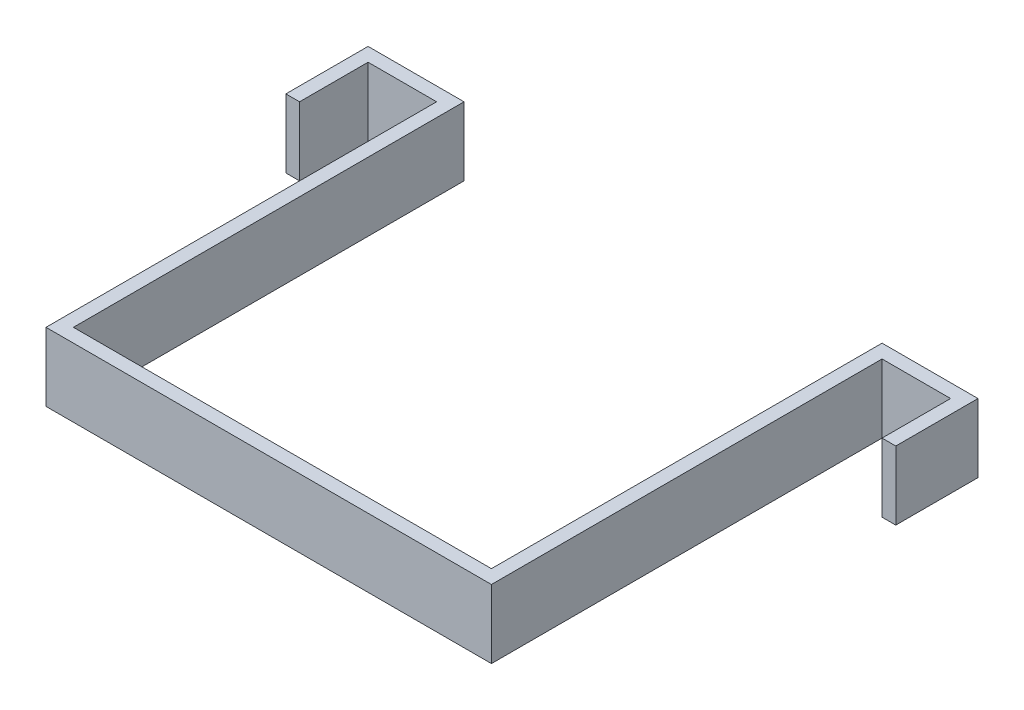
ISO-10303-21;
HEADER;
FILE_DESCRIPTION(('STEP AP214'),'2;1');
FILE_NAME('part.step','',(''),(''),'','','');
FILE_SCHEMA(('AUTOMOTIVE_DESIGN { 1 0 10303 214 1 1 1 1 }'));
ENDSEC;
DATA;
#1=APPLICATION_CONTEXT('core data for automotive mechanical design processes');
#2=APPLICATION_PROTOCOL_DEFINITION('international standard','automotive_design',2000,#1);
#3=PRODUCT_CONTEXT('',#1,'mechanical');
#4=PRODUCT('Part','Part','',(#3));
#5=PRODUCT_RELATED_PRODUCT_CATEGORY('part','',(#4));
#6=PRODUCT_DEFINITION_FORMATION('','',#4);
#7=PRODUCT_DEFINITION_CONTEXT('part definition',#1,'design');
#8=PRODUCT_DEFINITION('design','',#6,#7);
#9=PRODUCT_DEFINITION_SHAPE('','',#8);
#10=(LENGTH_UNIT() NAMED_UNIT(*) SI_UNIT(.MILLI.,.METRE.));
#11=(NAMED_UNIT(*) PLANE_ANGLE_UNIT() SI_UNIT($,.RADIAN.));
#12=(NAMED_UNIT(*) SI_UNIT($,.STERADIAN.) SOLID_ANGLE_UNIT());
#13=UNCERTAINTY_MEASURE_WITH_UNIT(LENGTH_MEASURE(1.E-05),#10,'distance_accuracy_value','');
#14=(GEOMETRIC_REPRESENTATION_CONTEXT(3) GLOBAL_UNCERTAINTY_ASSIGNED_CONTEXT((#13)) GLOBAL_UNIT_ASSIGNED_CONTEXT((#10,
#11,#12)) REPRESENTATION_CONTEXT('',''));
#15=CARTESIAN_POINT('',(0.,0.,0.));
#16=DIRECTION('',(0.,0.,1.));
#17=DIRECTION('',(1.,0.,0.));
#18=AXIS2_PLACEMENT_3D('',#15,#16,#17);
#19=CARTESIAN_POINT('',(-113.03,12.7,25.4));
#20=DIRECTION('',(0.,0.,-1.));
#21=DIRECTION('',(-1.,0.,0.));
#22=AXIS2_PLACEMENT_3D('',#19,#20,#21);
#23=PLANE('',#22);
#24=DIRECTION('',(1.,0.,0.));
#25=VECTOR('',#24,1.);
#26=CARTESIAN_POINT('',(-113.03,-12.7,25.4));
#27=LINE('',#26,#25);
#28=CARTESIAN_POINT('',(-113.03,-12.7,25.4));
#29=VERTEX_POINT('',#28);
#30=CARTESIAN_POINT('',(-107.95,-12.7,25.4));
#31=VERTEX_POINT('',#30);
#32=EDGE_CURVE('E177',#29,#31,#27,.T.);
#33=ORIENTED_EDGE('',*,*,#32,.T.);
#34=DIRECTION('',(0.,-1.,0.));
#35=VECTOR('',#34,1.);
#36=CARTESIAN_POINT('',(-107.95,12.7,25.4));
#37=LINE('',#36,#35);
#38=CARTESIAN_POINT('',(-107.95,12.7,25.4));
#39=VERTEX_POINT('',#38);
#40=EDGE_CURVE('E11',#39,#31,#37,.T.);
#41=ORIENTED_EDGE('',*,*,#40,.F.);
#42=DIRECTION('',(1.,0.,0.));
#43=VECTOR('',#42,1.);
#44=CARTESIAN_POINT('',(-113.03,12.7,25.4));
#45=LINE('',#44,#43);
#46=CARTESIAN_POINT('',(-113.03,12.7,25.4));
#47=VERTEX_POINT('',#46);
#48=EDGE_CURVE('E207',#47,#39,#45,.T.);
#49=ORIENTED_EDGE('',*,*,#48,.F.);
#50=DIRECTION('',(0.,-1.,0.));
#51=VECTOR('',#50,1.);
#52=CARTESIAN_POINT('',(-113.03,12.7,25.4));
#53=LINE('',#52,#51);
#54=EDGE_CURVE('E173',#47,#29,#53,.T.);
#55=ORIENTED_EDGE('',*,*,#54,.T.);
#56=EDGE_LOOP('',(#33,#41,#49,#55));
#57=FACE_BOUND('',#56,.T.);
#58=ADVANCED_FACE('F33',(#57),#23,.F.);
#59=CARTESIAN_POINT('',(-107.95,12.7,25.4));
#60=DIRECTION('',(-1.,0.,0.));
#61=DIRECTION('',(0.,0.,1.));
#62=AXIS2_PLACEMENT_3D('',#59,#60,#61);
#63=PLANE('',#62);
#64=DIRECTION('',(0.,0.,-1.));
#65=VECTOR('',#64,1.);
#66=CARTESIAN_POINT('',(-107.95,-12.7,25.4));
#67=LINE('',#66,#65);
#68=CARTESIAN_POINT('',(-107.95,-12.7,0.));
#69=VERTEX_POINT('',#68);
#70=EDGE_CURVE('E180',#31,#69,#67,.T.);
#71=ORIENTED_EDGE('',*,*,#70,.T.);
#72=DIRECTION('',(0.,-1.,0.));
#73=VECTOR('',#72,1.);
#74=CARTESIAN_POINT('',(-107.95,12.7,0.));
#75=LINE('',#74,#73);
#76=CARTESIAN_POINT('',(-107.95,12.7,0.));
#77=VERTEX_POINT('',#76);
#78=EDGE_CURVE('E41',#77,#69,#75,.T.);
#79=ORIENTED_EDGE('',*,*,#78,.F.);
#80=DIRECTION('',(0.,0.,-1.));
#81=VECTOR('',#80,1.);
#82=CARTESIAN_POINT('',(-107.95,12.7,25.4));
#83=LINE('',#82,#81);
#84=EDGE_CURVE('E116',#39,#77,#83,.T.);
#85=ORIENTED_EDGE('',*,*,#84,.F.);
#86=ORIENTED_EDGE('',*,*,#40,.T.);
#87=EDGE_LOOP('',(#71,#79,#85,#86));
#88=FACE_BOUND('',#87,.T.);
#89=ADVANCED_FACE('F305',(#88),#63,.F.);
#90=CARTESIAN_POINT('',(-107.95,12.7,0.));
#91=DIRECTION('',(0.,0.,-1.));
#92=DIRECTION('',(-1.,0.,0.));
#93=AXIS2_PLACEMENT_3D('',#90,#91,#92);
#94=PLANE('',#93);
#95=DIRECTION('',(1.,0.,0.));
#96=VECTOR('',#95,1.);
#97=CARTESIAN_POINT('',(-107.95,-12.7,0.));
#98=LINE('',#97,#96);
#99=CARTESIAN_POINT('',(-82.55,-12.7,0.));
#100=VERTEX_POINT('',#99);
#101=EDGE_CURVE('E182',#69,#100,#98,.T.);
#102=ORIENTED_EDGE('',*,*,#101,.T.);
#103=DIRECTION('',(0.,-1.,0.));
#104=VECTOR('',#103,1.);
#105=CARTESIAN_POINT('',(-82.55,12.7,0.));
#106=LINE('',#105,#104);
#107=CARTESIAN_POINT('',(-82.55,12.7,0.));
#108=VERTEX_POINT('',#107);
#109=EDGE_CURVE('E238',#108,#100,#106,.T.);
#110=ORIENTED_EDGE('',*,*,#109,.F.);
#111=DIRECTION('',(1.,0.,0.));
#112=VECTOR('',#111,1.);
#113=CARTESIAN_POINT('',(-107.95,12.7,0.));
#114=LINE('',#113,#112);
#115=EDGE_CURVE('E246',#77,#108,#114,.T.);
#116=ORIENTED_EDGE('',*,*,#115,.F.);
#117=ORIENTED_EDGE('',*,*,#78,.T.);
#118=EDGE_LOOP('',(#102,#110,#116,#117));
#119=FACE_BOUND('',#118,.T.);
#120=ADVANCED_FACE('F244',(#119),#94,.F.);
#121=CARTESIAN_POINT('',(-82.55,12.7,144.78));
#122=DIRECTION('',(1.,0.,0.));
#123=DIRECTION('',(0.,0.,-1.));
#124=AXIS2_PLACEMENT_3D('',#121,#122,#123);
#125=PLANE('',#124);
#126=DIRECTION('',(0.,0.,1.));
#127=VECTOR('',#126,1.);
#128=CARTESIAN_POINT('',(-82.55,-12.7,144.78));
#129=LINE('',#128,#127);
#130=CARTESIAN_POINT('',(-82.55,-12.7,144.78));
#131=VERTEX_POINT('',#130);
#132=EDGE_CURVE('E184',#100,#131,#129,.T.);
#133=ORIENTED_EDGE('',*,*,#132,.T.);
#134=DIRECTION('',(0.,-1.,0.));
#135=VECTOR('',#134,1.);
#136=CARTESIAN_POINT('',(-82.55,12.7,144.78));
#137=LINE('',#136,#135);
#138=CARTESIAN_POINT('',(-82.55,12.7,144.78));
#139=VERTEX_POINT('',#138);
#140=EDGE_CURVE('E235',#139,#131,#137,.T.);
#141=ORIENTED_EDGE('',*,*,#140,.F.);
#142=DIRECTION('',(0.,0.,1.));
#143=VECTOR('',#142,1.);
#144=CARTESIAN_POINT('',(-82.55,12.7,144.78));
#145=LINE('',#144,#143);
#146=EDGE_CURVE('E264',#108,#139,#145,.T.);
#147=ORIENTED_EDGE('',*,*,#146,.F.);
#148=ORIENTED_EDGE('',*,*,#109,.T.);
#149=EDGE_LOOP('',(#133,#141,#147,#148));
#150=FACE_BOUND('',#149,.T.);
#151=ADVANCED_FACE('F255',(#150),#125,.F.);
#152=CARTESIAN_POINT('',(82.55,12.7,144.78));
#153=DIRECTION('',(0.,0.,-1.));
#154=DIRECTION('',(-1.,0.,0.));
#155=AXIS2_PLACEMENT_3D('',#152,#153,#154);
#156=PLANE('',#155);
#157=DIRECTION('',(1.,0.,0.));
#158=VECTOR('',#157,1.);
#159=CARTESIAN_POINT('',(82.55,-12.7,144.78));
#160=LINE('',#159,#158);
#161=CARTESIAN_POINT('',(82.55,-12.7,144.78));
#162=VERTEX_POINT('',#161);
#163=EDGE_CURVE('E186',#131,#162,#160,.T.);
#164=ORIENTED_EDGE('',*,*,#163,.T.);
#165=DIRECTION('',(0.,-1.,0.));
#166=VECTOR('',#165,1.);
#167=CARTESIAN_POINT('',(82.55,12.7,144.78));
#168=LINE('',#167,#166);
#169=CARTESIAN_POINT('',(82.55,12.7,144.78));
#170=VERTEX_POINT('',#169);
#171=EDGE_CURVE('E232',#170,#162,#168,.T.);
#172=ORIENTED_EDGE('',*,*,#171,.F.);
#173=DIRECTION('',(1.,0.,0.));
#174=VECTOR('',#173,1.);
#175=CARTESIAN_POINT('',(82.55,12.7,144.78));
#176=LINE('',#175,#174);
#177=EDGE_CURVE('E261',#139,#170,#176,.T.);
#178=ORIENTED_EDGE('',*,*,#177,.F.);
#179=ORIENTED_EDGE('',*,*,#140,.T.);
#180=EDGE_LOOP('',(#164,#172,#178,#179));
#181=FACE_BOUND('',#180,.T.);
#182=ADVANCED_FACE('F259',(#181),#156,.F.);
#183=CARTESIAN_POINT('',(82.55,12.7,144.78));
#184=DIRECTION('',(-1.,0.,0.));
#185=DIRECTION('',(0.,0.,1.));
#186=AXIS2_PLACEMENT_3D('',#183,#184,#185);
#187=PLANE('',#186);
#188=DIRECTION('',(0.,0.,-1.));
#189=VECTOR('',#188,1.);
#190=CARTESIAN_POINT('',(82.55,-12.7,144.78));
#191=LINE('',#190,#189);
#192=CARTESIAN_POINT('',(82.55,-12.7,0.));
#193=VERTEX_POINT('',#192);
#194=EDGE_CURVE('E188',#162,#193,#191,.T.);
#195=ORIENTED_EDGE('',*,*,#194,.T.);
#196=DIRECTION('',(0.,-1.,0.));
#197=VECTOR('',#196,1.);
#198=CARTESIAN_POINT('',(82.55,12.7,0.));
#199=LINE('',#198,#197);
#200=CARTESIAN_POINT('',(82.55,12.7,0.));
#201=VERTEX_POINT('',#200);
#202=EDGE_CURVE('E229',#201,#193,#199,.T.);
#203=ORIENTED_EDGE('',*,*,#202,.F.);
#204=DIRECTION('',(0.,0.,-1.));
#205=VECTOR('',#204,1.);
#206=CARTESIAN_POINT('',(82.55,12.7,144.78));
#207=LINE('',#206,#205);
#208=EDGE_CURVE('E263',#170,#201,#207,.T.);
#209=ORIENTED_EDGE('',*,*,#208,.F.);
#210=ORIENTED_EDGE('',*,*,#171,.T.);
#211=EDGE_LOOP('',(#195,#203,#209,#210));
#212=FACE_BOUND('',#211,.T.);
#213=ADVANCED_FACE('F318',(#212),#187,.F.);
#214=CARTESIAN_POINT('',(107.95,12.7,0.));
#215=DIRECTION('',(0.,0.,-1.));
#216=DIRECTION('',(-1.,0.,0.));
#217=AXIS2_PLACEMENT_3D('',#214,#215,#216);
#218=PLANE('',#217);
#219=DIRECTION('',(1.,0.,0.));
#220=VECTOR('',#219,1.);
#221=CARTESIAN_POINT('',(107.95,-12.7,0.));
#222=LINE('',#221,#220);
#223=CARTESIAN_POINT('',(107.95,-12.7,0.));
#224=VERTEX_POINT('',#223);
#225=EDGE_CURVE('E190',#193,#224,#222,.T.);
#226=ORIENTED_EDGE('',*,*,#225,.T.);
#227=DIRECTION('',(0.,-1.,0.));
#228=VECTOR('',#227,1.);
#229=CARTESIAN_POINT('',(107.95,12.7,0.));
#230=LINE('',#229,#228);
#231=CARTESIAN_POINT('',(107.95,12.7,0.));
#232=VERTEX_POINT('',#231);
#233=EDGE_CURVE('E226',#232,#224,#230,.T.);
#234=ORIENTED_EDGE('',*,*,#233,.F.);
#235=DIRECTION('',(1.,0.,0.));
#236=VECTOR('',#235,1.);
#237=CARTESIAN_POINT('',(107.95,12.7,0.));
#238=LINE('',#237,#236);
#239=EDGE_CURVE('E266',#201,#232,#238,.T.);
#240=ORIENTED_EDGE('',*,*,#239,.F.);
#241=ORIENTED_EDGE('',*,*,#202,.T.);
#242=EDGE_LOOP('',(#226,#234,#240,#241));
#243=FACE_BOUND('',#242,.T.);
#244=ADVANCED_FACE('F321',(#243),#218,.F.);
#245=CARTESIAN_POINT('',(107.95,12.7,25.4));
#246=DIRECTION('',(1.,0.,0.));
#247=DIRECTION('',(0.,0.,-1.));
#248=AXIS2_PLACEMENT_3D('',#245,#246,#247);
#249=PLANE('',#248);
#250=DIRECTION('',(0.,0.,1.));
#251=VECTOR('',#250,1.);
#252=CARTESIAN_POINT('',(107.95,-12.7,25.4));
#253=LINE('',#252,#251);
#254=CARTESIAN_POINT('',(107.95,-12.7,25.4));
#255=VERTEX_POINT('',#254);
#256=EDGE_CURVE('E192',#224,#255,#253,.T.);
#257=ORIENTED_EDGE('',*,*,#256,.T.);
#258=DIRECTION('',(0.,-1.,0.));
#259=VECTOR('',#258,1.);
#260=CARTESIAN_POINT('',(107.95,12.7,25.4));
#261=LINE('',#260,#259);
#262=CARTESIAN_POINT('',(107.95,12.7,25.4));
#263=VERTEX_POINT('',#262);
#264=EDGE_CURVE('E223',#263,#255,#261,.T.);
#265=ORIENTED_EDGE('',*,*,#264,.F.);
#266=DIRECTION('',(0.,0.,1.));
#267=VECTOR('',#266,1.);
#268=CARTESIAN_POINT('',(107.95,12.7,25.4));
#269=LINE('',#268,#267);
#270=EDGE_CURVE('E272',#232,#263,#269,.T.);
#271=ORIENTED_EDGE('',*,*,#270,.F.);
#272=ORIENTED_EDGE('',*,*,#233,.T.);
#273=EDGE_LOOP('',(#257,#265,#271,#272));
#274=FACE_BOUND('',#273,.T.);
#275=ADVANCED_FACE('F325',(#274),#249,.F.);
#276=CARTESIAN_POINT('',(113.03,12.7,25.4));
#277=DIRECTION('',(0.,0.,-1.));
#278=DIRECTION('',(-1.,0.,0.));
#279=AXIS2_PLACEMENT_3D('',#276,#277,#278);
#280=PLANE('',#279);
#281=DIRECTION('',(1.,0.,0.));
#282=VECTOR('',#281,1.);
#283=CARTESIAN_POINT('',(113.03,-12.7,25.4));
#284=LINE('',#283,#282);
#285=CARTESIAN_POINT('',(113.03,-12.7,25.4));
#286=VERTEX_POINT('',#285);
#287=EDGE_CURVE('E194',#255,#286,#284,.T.);
#288=ORIENTED_EDGE('',*,*,#287,.T.);
#289=DIRECTION('',(0.,-1.,0.));
#290=VECTOR('',#289,1.);
#291=CARTESIAN_POINT('',(113.03,12.7,25.4));
#292=LINE('',#291,#290);
#293=CARTESIAN_POINT('',(113.03,12.7,25.4));
#294=VERTEX_POINT('',#293);
#295=EDGE_CURVE('E220',#294,#286,#292,.T.);
#296=ORIENTED_EDGE('',*,*,#295,.F.);
#297=DIRECTION('',(1.,0.,0.));
#298=VECTOR('',#297,1.);
#299=CARTESIAN_POINT('',(113.03,12.7,25.4));
#300=LINE('',#299,#298);
#301=EDGE_CURVE('E274',#263,#294,#300,.T.);
#302=ORIENTED_EDGE('',*,*,#301,.F.);
#303=ORIENTED_EDGE('',*,*,#264,.T.);
#304=EDGE_LOOP('',(#288,#296,#302,#303));
#305=FACE_BOUND('',#304,.T.);
#306=ADVANCED_FACE('F329',(#305),#280,.F.);
#307=CARTESIAN_POINT('',(113.03,12.7,25.4));
#308=DIRECTION('',(-1.,0.,0.));
#309=DIRECTION('',(0.,0.,1.));
#310=AXIS2_PLACEMENT_3D('',#307,#308,#309);
#311=PLANE('',#310);
#312=DIRECTION('',(0.,0.,-1.));
#313=VECTOR('',#312,1.);
#314=CARTESIAN_POINT('',(113.03,-12.7,25.4));
#315=LINE('',#314,#313);
#316=CARTESIAN_POINT('',(113.03,-12.7,-5.08));
#317=VERTEX_POINT('',#316);
#318=EDGE_CURVE('E196',#286,#317,#315,.T.);
#319=ORIENTED_EDGE('',*,*,#318,.T.);
#320=DIRECTION('',(0.,-1.,0.));
#321=VECTOR('',#320,1.);
#322=CARTESIAN_POINT('',(113.03,12.7,-5.08));
#323=LINE('',#322,#321);
#324=CARTESIAN_POINT('',(113.03,12.7,-5.08));
#325=VERTEX_POINT('',#324);
#326=EDGE_CURVE('E217',#325,#317,#323,.T.);
#327=ORIENTED_EDGE('',*,*,#326,.F.);
#328=DIRECTION('',(0.,0.,-1.));
#329=VECTOR('',#328,1.);
#330=CARTESIAN_POINT('',(113.03,12.7,25.4));
#331=LINE('',#330,#329);
#332=EDGE_CURVE('E276',#294,#325,#331,.T.);
#333=ORIENTED_EDGE('',*,*,#332,.F.);
#334=ORIENTED_EDGE('',*,*,#295,.T.);
#335=EDGE_LOOP('',(#319,#327,#333,#334));
#336=FACE_BOUND('',#335,.T.);
#337=ADVANCED_FACE('F333',(#336),#311,.F.);
#338=CARTESIAN_POINT('',(113.03,12.7,-5.08));
#339=DIRECTION('',(0.,0.,1.));
#340=DIRECTION('',(1.,0.,0.));
#341=AXIS2_PLACEMENT_3D('',#338,#339,#340);
#342=PLANE('',#341);
#343=DIRECTION('',(-1.,0.,0.));
#344=VECTOR('',#343,1.);
#345=CARTESIAN_POINT('',(113.03,-12.7,-5.08));
#346=LINE('',#345,#344);
#347=CARTESIAN_POINT('',(77.47,-12.7,-5.08));
#348=VERTEX_POINT('',#347);
#349=EDGE_CURVE('E198',#317,#348,#346,.T.);
#350=ORIENTED_EDGE('',*,*,#349,.T.);
#351=DIRECTION('',(0.,-1.,0.));
#352=VECTOR('',#351,1.);
#353=CARTESIAN_POINT('',(77.47,12.7,-5.08));
#354=LINE('',#353,#352);
#355=CARTESIAN_POINT('',(77.47,12.7,-5.08));
#356=VERTEX_POINT('',#355);
#357=EDGE_CURVE('E214',#356,#348,#354,.T.);
#358=ORIENTED_EDGE('',*,*,#357,.F.);
#359=DIRECTION('',(-1.,0.,0.));
#360=VECTOR('',#359,1.);
#361=CARTESIAN_POINT('',(113.03,12.7,-5.08));
#362=LINE('',#361,#360);
#363=EDGE_CURVE('E278',#325,#356,#362,.T.);
#364=ORIENTED_EDGE('',*,*,#363,.F.);
#365=ORIENTED_EDGE('',*,*,#326,.T.);
#366=EDGE_LOOP('',(#350,#358,#364,#365));
#367=FACE_BOUND('',#366,.T.);
#368=ADVANCED_FACE('F337',(#367),#342,.F.);
#369=CARTESIAN_POINT('',(77.47,12.7,-5.08));
#370=DIRECTION('',(1.,0.,0.));
#371=DIRECTION('',(0.,0.,-1.));
#372=AXIS2_PLACEMENT_3D('',#369,#370,#371);
#373=PLANE('',#372);
#374=DIRECTION('',(0.,0.,1.));
#375=VECTOR('',#374,1.);
#376=CARTESIAN_POINT('',(77.47,-12.7,-5.08));
#377=LINE('',#376,#375);
#378=CARTESIAN_POINT('',(77.47,-12.7,139.7));
#379=VERTEX_POINT('',#378);
#380=EDGE_CURVE('E200',#348,#379,#377,.T.);
#381=ORIENTED_EDGE('',*,*,#380,.T.);
#382=DIRECTION('',(0.,-1.,0.));
#383=VECTOR('',#382,1.);
#384=CARTESIAN_POINT('',(77.47,12.7,139.7));
#385=LINE('',#384,#383);
#386=CARTESIAN_POINT('',(77.47,12.7,139.7));
#387=VERTEX_POINT('',#386);
#388=EDGE_CURVE('E211',#387,#379,#385,.T.);
#389=ORIENTED_EDGE('',*,*,#388,.F.);
#390=DIRECTION('',(0.,0.,1.));
#391=VECTOR('',#390,1.);
#392=CARTESIAN_POINT('',(77.47,12.7,-5.08));
#393=LINE('',#392,#391);
#394=EDGE_CURVE('E280',#356,#387,#393,.T.);
#395=ORIENTED_EDGE('',*,*,#394,.F.);
#396=ORIENTED_EDGE('',*,*,#357,.T.);
#397=EDGE_LOOP('',(#381,#389,#395,#396));
#398=FACE_BOUND('',#397,.T.);
#399=ADVANCED_FACE('F286',(#398),#373,.F.);
#400=CARTESIAN_POINT('',(-77.47,12.7,139.7));
#401=DIRECTION('',(0.,0.,1.));
#402=DIRECTION('',(1.,0.,0.));
#403=AXIS2_PLACEMENT_3D('',#400,#401,#402);
#404=PLANE('',#403);
#405=DIRECTION('',(-1.,0.,0.));
#406=VECTOR('',#405,1.);
#407=CARTESIAN_POINT('',(-77.47,-12.7,139.7));
#408=LINE('',#407,#406);
#409=CARTESIAN_POINT('',(-77.47,-12.7,139.7));
#410=VERTEX_POINT('',#409);
#411=EDGE_CURVE('E202',#379,#410,#408,.T.);
#412=ORIENTED_EDGE('',*,*,#411,.T.);
#413=DIRECTION('',(0.,-1.,0.));
#414=VECTOR('',#413,1.);
#415=CARTESIAN_POINT('',(-77.47,12.7,139.7));
#416=LINE('',#415,#414);
#417=CARTESIAN_POINT('',(-77.47,12.7,139.7));
#418=VERTEX_POINT('',#417);
#419=EDGE_CURVE('E168',#418,#410,#416,.T.);
#420=ORIENTED_EDGE('',*,*,#419,.F.);
#421=DIRECTION('',(-1.,0.,0.));
#422=VECTOR('',#421,1.);
#423=CARTESIAN_POINT('',(-77.47,12.7,139.7));
#424=LINE('',#423,#422);
#425=EDGE_CURVE('E159',#387,#418,#424,.T.);
#426=ORIENTED_EDGE('',*,*,#425,.F.);
#427=ORIENTED_EDGE('',*,*,#388,.T.);
#428=EDGE_LOOP('',(#412,#420,#426,#427));
#429=FACE_BOUND('',#428,.T.);
#430=ADVANCED_FACE('F290',(#429),#404,.F.);
#431=CARTESIAN_POINT('',(-77.47,12.7,-5.08));
#432=DIRECTION('',(-1.,0.,0.));
#433=DIRECTION('',(0.,0.,1.));
#434=AXIS2_PLACEMENT_3D('',#431,#432,#433);
#435=PLANE('',#434);
#436=DIRECTION('',(0.,0.,-1.));
#437=VECTOR('',#436,1.);
#438=CARTESIAN_POINT('',(-77.47,-12.7,-5.08));
#439=LINE('',#438,#437);
#440=CARTESIAN_POINT('',(-77.47,-12.7,-5.08));
#441=VERTEX_POINT('',#440);
#442=EDGE_CURVE('E167',#410,#441,#439,.T.);
#443=ORIENTED_EDGE('',*,*,#442,.T.);
#444=DIRECTION('',(0.,-1.,0.));
#445=VECTOR('',#444,1.);
#446=CARTESIAN_POINT('',(-77.47,12.7,-5.08));
#447=LINE('',#446,#445);
#448=CARTESIAN_POINT('',(-77.47,12.7,-5.08));
#449=VERTEX_POINT('',#448);
#450=EDGE_CURVE('E164',#449,#441,#447,.T.);
#451=ORIENTED_EDGE('',*,*,#450,.F.);
#452=DIRECTION('',(0.,0.,-1.));
#453=VECTOR('',#452,1.);
#454=CARTESIAN_POINT('',(-77.47,12.7,-5.08));
#455=LINE('',#454,#453);
#456=EDGE_CURVE('E153',#418,#449,#455,.T.);
#457=ORIENTED_EDGE('',*,*,#456,.F.);
#458=ORIENTED_EDGE('',*,*,#419,.T.);
#459=EDGE_LOOP('',(#443,#451,#457,#458));
#460=FACE_BOUND('',#459,.T.);
#461=ADVANCED_FACE('F165',(#460),#435,.F.);
#462=CARTESIAN_POINT('',(-113.03,12.7,-5.08));
#463=DIRECTION('',(0.,0.,1.));
#464=DIRECTION('',(1.,0.,0.));
#465=AXIS2_PLACEMENT_3D('',#462,#463,#464);
#466=PLANE('',#465);
#467=DIRECTION('',(-1.,0.,0.));
#468=VECTOR('',#467,1.);
#469=CARTESIAN_POINT('',(-113.03,-12.7,-5.08));
#470=LINE('',#469,#468);
#471=CARTESIAN_POINT('',(-113.03,-12.7,-5.08));
#472=VERTEX_POINT('',#471);
#473=EDGE_CURVE('E102',#441,#472,#470,.T.);
#474=ORIENTED_EDGE('',*,*,#473,.T.);
#475=DIRECTION('',(0.,-1.,0.));
#476=VECTOR('',#475,1.);
#477=CARTESIAN_POINT('',(-113.03,12.7,-5.08));
#478=LINE('',#477,#476);
#479=CARTESIAN_POINT('',(-113.03,12.7,-5.08));
#480=VERTEX_POINT('',#479);
#481=EDGE_CURVE('E169',#480,#472,#478,.T.);
#482=ORIENTED_EDGE('',*,*,#481,.F.);
#483=DIRECTION('',(-1.,0.,0.));
#484=VECTOR('',#483,1.);
#485=CARTESIAN_POINT('',(-113.03,12.7,-5.08));
#486=LINE('',#485,#484);
#487=EDGE_CURVE('E157',#449,#480,#486,.T.);
#488=ORIENTED_EDGE('',*,*,#487,.F.);
#489=ORIENTED_EDGE('',*,*,#450,.T.);
#490=EDGE_LOOP('',(#474,#482,#488,#489));
#491=FACE_BOUND('',#490,.T.);
#492=ADVANCED_FACE('F171',(#491),#466,.F.);
#493=CARTESIAN_POINT('',(-113.03,12.7,25.4));
#494=DIRECTION('',(1.,0.,0.));
#495=DIRECTION('',(0.,0.,-1.));
#496=AXIS2_PLACEMENT_3D('',#493,#494,#495);
#497=PLANE('',#496);
#498=DIRECTION('',(0.,0.,1.));
#499=VECTOR('',#498,1.);
#500=CARTESIAN_POINT('',(-113.03,-12.7,25.4));
#501=LINE('',#500,#499);
#502=EDGE_CURVE('E108',#472,#29,#501,.T.);
#503=ORIENTED_EDGE('',*,*,#502,.T.);
#504=ORIENTED_EDGE('',*,*,#54,.F.);
#505=DIRECTION('',(0.,0.,1.));
#506=VECTOR('',#505,1.);
#507=CARTESIAN_POINT('',(-113.03,12.7,25.4));
#508=LINE('',#507,#506);
#509=EDGE_CURVE('E49',#480,#47,#508,.T.);
#510=ORIENTED_EDGE('',*,*,#509,.F.);
#511=ORIENTED_EDGE('',*,*,#481,.T.);
#512=EDGE_LOOP('',(#503,#504,#510,#511));
#513=FACE_BOUND('',#512,.T.);
#514=ADVANCED_FACE('F294',(#513),#497,.F.);
#515=CARTESIAN_POINT('',(0.,12.7,0.));
#516=DIRECTION('',(0.,1.,0.));
#517=DIRECTION('',(0.,0.,1.));
#518=AXIS2_PLACEMENT_3D('',#515,#516,#517);
#519=PLANE('',#518);
#520=ORIENTED_EDGE('',*,*,#48,.T.);
#521=ORIENTED_EDGE('',*,*,#84,.T.);
#522=ORIENTED_EDGE('',*,*,#115,.T.);
#523=ORIENTED_EDGE('',*,*,#146,.T.);
#524=ORIENTED_EDGE('',*,*,#177,.T.);
#525=ORIENTED_EDGE('',*,*,#208,.T.);
#526=ORIENTED_EDGE('',*,*,#239,.T.);
#527=ORIENTED_EDGE('',*,*,#270,.T.);
#528=ORIENTED_EDGE('',*,*,#301,.T.);
#529=ORIENTED_EDGE('',*,*,#332,.T.);
#530=ORIENTED_EDGE('',*,*,#363,.T.);
#531=ORIENTED_EDGE('',*,*,#394,.T.);
#532=ORIENTED_EDGE('',*,*,#425,.T.);
#533=ORIENTED_EDGE('',*,*,#456,.T.);
#534=ORIENTED_EDGE('',*,*,#487,.T.);
#535=ORIENTED_EDGE('',*,*,#509,.T.);
#536=EDGE_LOOP('',(#520,#521,#522,#523,#524,#525,#526,#527,#528,#529,#530,#531,#532,#533,#534,#535));
#537=FACE_BOUND('',#536,.T.);
#538=ADVANCED_FACE('F155',(#537),#519,.T.);
#539=CARTESIAN_POINT('',(0.,-12.7,0.));
#540=DIRECTION('',(0.,1.,0.));
#541=DIRECTION('',(0.,0.,1.));
#542=AXIS2_PLACEMENT_3D('',#539,#540,#541);
#543=PLANE('',#542);
#544=ORIENTED_EDGE('',*,*,#32,.F.);
#545=ORIENTED_EDGE('',*,*,#502,.F.);
#546=ORIENTED_EDGE('',*,*,#473,.F.);
#547=ORIENTED_EDGE('',*,*,#442,.F.);
#548=ORIENTED_EDGE('',*,*,#411,.F.);
#549=ORIENTED_EDGE('',*,*,#380,.F.);
#550=ORIENTED_EDGE('',*,*,#349,.F.);
#551=ORIENTED_EDGE('',*,*,#318,.F.);
#552=ORIENTED_EDGE('',*,*,#287,.F.);
#553=ORIENTED_EDGE('',*,*,#256,.F.);
#554=ORIENTED_EDGE('',*,*,#225,.F.);
#555=ORIENTED_EDGE('',*,*,#194,.F.);
#556=ORIENTED_EDGE('',*,*,#163,.F.);
#557=ORIENTED_EDGE('',*,*,#132,.F.);
#558=ORIENTED_EDGE('',*,*,#101,.F.);
#559=ORIENTED_EDGE('',*,*,#70,.F.);
#560=EDGE_LOOP('',(#544,#545,#546,#547,#548,#549,#550,#551,#552,#553,#554,#555,#556,#557,#558,#559));
#561=FACE_BOUND('',#560,.T.);
#562=ADVANCED_FACE('F250',(#561),#543,.F.);
#563=CLOSED_SHELL('',(#58,#89,#120,#151,#182,#213,#244,#275,#306,#337,#368,#399,#430,#461,#492,
#514,#538,#562));
#564=MANIFOLD_SOLID_BREP('B2',#563);
#565=ADVANCED_BREP_SHAPE_REPRESENTATION('',(#18,#564),#14);
#566=SHAPE_DEFINITION_REPRESENTATION(#9,#565);
ENDSEC;
END-ISO-10303-21;
